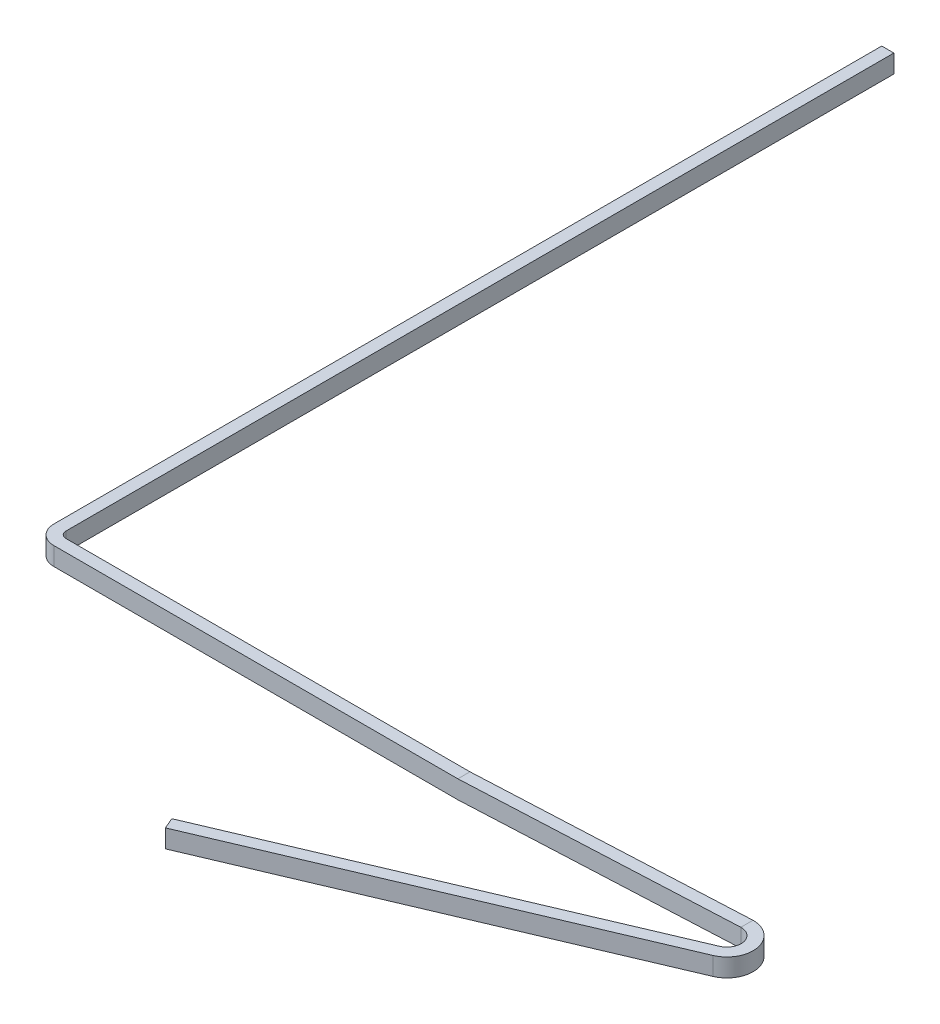
ISO-10303-21;
HEADER;
FILE_DESCRIPTION(('STEP AP214'),'2;1');
FILE_NAME('part.step','',(''),(''),'','','');
FILE_SCHEMA(('AUTOMOTIVE_DESIGN { 1 0 10303 214 1 1 1 1 }'));
ENDSEC;
DATA;
#1=APPLICATION_CONTEXT('core data for automotive mechanical design processes');
#2=APPLICATION_PROTOCOL_DEFINITION('international standard','automotive_design',2000,#1);
#3=PRODUCT_CONTEXT('',#1,'mechanical');
#4=PRODUCT('Part','Part','',(#3));
#5=PRODUCT_RELATED_PRODUCT_CATEGORY('part','',(#4));
#6=PRODUCT_DEFINITION_FORMATION('','',#4);
#7=PRODUCT_DEFINITION_CONTEXT('part definition',#1,'design');
#8=PRODUCT_DEFINITION('design','',#6,#7);
#9=PRODUCT_DEFINITION_SHAPE('','',#8);
#10=(LENGTH_UNIT() NAMED_UNIT(*) SI_UNIT(.MILLI.,.METRE.));
#11=(NAMED_UNIT(*) PLANE_ANGLE_UNIT() SI_UNIT($,.RADIAN.));
#12=(NAMED_UNIT(*) SI_UNIT($,.STERADIAN.) SOLID_ANGLE_UNIT());
#13=UNCERTAINTY_MEASURE_WITH_UNIT(LENGTH_MEASURE(1.E-05),#10,'distance_accuracy_value','');
#14=(GEOMETRIC_REPRESENTATION_CONTEXT(3) GLOBAL_UNCERTAINTY_ASSIGNED_CONTEXT((#13)) GLOBAL_UNIT_ASSIGNED_CONTEXT((#10,
#11,#12)) REPRESENTATION_CONTEXT('',''));
#15=CARTESIAN_POINT('',(0.,0.,0.));
#16=DIRECTION('',(0.,0.,1.));
#17=DIRECTION('',(1.,0.,0.));
#18=AXIS2_PLACEMENT_3D('',#15,#16,#17);
#19=CARTESIAN_POINT('',(0.31,-0.225,20.64));
#20=DIRECTION('',(0.,0.,-1.));
#21=DIRECTION('',(0.,1.,0.));
#22=AXIS2_PLACEMENT_3D('',#19,#20,#21);
#23=PLANE('',#22);
#24=DIRECTION('',(1.,0.,0.));
#25=VECTOR('',#24,1.);
#26=CARTESIAN_POINT('',(5.08257008653312,-0.225,20.64));
#27=LINE('',#26,#25);
#28=CARTESIAN_POINT('',(0.31,-0.225,20.64));
#29=VERTEX_POINT('',#28);
#30=CARTESIAN_POINT('',(10.3151401730662,-0.225,20.64));
#31=VERTEX_POINT('',#30);
#32=EDGE_CURVE('E289',#29,#31,#27,.T.);
#33=ORIENTED_EDGE('',*,*,#32,.F.);
#34=DIRECTION('',(0.,-1.,0.));
#35=VECTOR('',#34,1.);
#36=CARTESIAN_POINT('',(0.31,0.,20.64));
#37=LINE('',#36,#35);
#38=CARTESIAN_POINT('',(0.31,0.225,20.64));
#39=VERTEX_POINT('',#38);
#40=EDGE_CURVE('E313',#39,#29,#37,.T.);
#41=ORIENTED_EDGE('',*,*,#40,.F.);
#42=DIRECTION('',(-1.,0.,0.));
#43=VECTOR('',#42,1.);
#44=CARTESIAN_POINT('',(5.07742991346688,0.225,20.64));
#45=LINE('',#44,#43);
#46=CARTESIAN_POINT('',(10.3048598269338,0.225,20.64));
#47=VERTEX_POINT('',#46);
#48=EDGE_CURVE('E263',#47,#39,#45,.T.);
#49=ORIENTED_EDGE('',*,*,#48,.F.);
#50=DIRECTION('',(-0.99895673691156,-0.0456665936873857,0.));
#51=VECTOR('',#50,1.);
#52=CARTESIAN_POINT('',(13.8048598269338,0.385,20.64));
#53=LINE('',#52,#51);
#54=CARTESIAN_POINT('',(17.3048598270921,0.545,20.6399993303949));
#55=VERTEX_POINT('',#54);
#56=EDGE_CURVE('E132',#55,#47,#53,.T.);
#57=ORIENTED_EDGE('',*,*,#56,.F.);
#58=CARTESIAN_POINT('',(17.3151399102425,0.095,20.6400270025931));
#59=CARTESIAN_POINT('',(17.3146858380326,0.113749939832011,20.640022566309));
#60=CARTESIAN_POINT('',(17.3142341799739,0.132499938445602,20.6400186946619));
#61=CARTESIAN_POINT('',(17.3133361160169,0.169999935673656,20.6400120341087));
#62=CARTESIAN_POINT('',(17.3128897100834,0.188749934287275,20.6400092451953));
#63=CARTESIAN_POINT('',(17.3120025712003,0.226249935784667,20.6400047035344));
#64=CARTESIAN_POINT('',(17.3115618382115,0.24499993866751,20.6400029507797));
#65=CARTESIAN_POINT('',(17.3106853651243,0.282499926602732,20.640000709326));
#66=CARTESIAN_POINT('',(17.3102496249901,0.301249911654272,20.640000220618));
#67=CARTESIAN_POINT('',(17.3093871114534,0.338749894708382,20.639999576322));
#68=CARTESIAN_POINT('',(17.3089603379583,0.357499892708818,20.6399994207307));
#69=CARTESIAN_POINT('',(17.3081165142604,0.394999895451141,20.6399990732163));
#70=CARTESIAN_POINT('',(17.3076994639477,0.413749900190559,20.6399988812938));
#71=CARTESIAN_POINT('',(17.3068740138984,0.451249907745766,20.6399985545529));
#72=CARTESIAN_POINT('',(17.3064656140731,0.469999910559609,20.6399984197341));
#73=CARTESIAN_POINT('',(17.3056568493409,0.507499916188817,20.639998184916));
#74=CARTESIAN_POINT('',(17.3052564843596,0.526249919002582,20.6399980849164));
#75=CARTESIAN_POINT('',(17.3048598274088,0.545,20.6399979911846));
#76=B_SPLINE_CURVE_WITH_KNOTS('',3,(#58,#59,#60,#61,#62,#63,#64,#65,#66,#67,#68,#69,#70,#71,#72,
#73,#74,#75),.UNSPECIFIED.,.F.,.F.,(4,2,2,2,2,2,2,2,4),(0.,0.0562663133702442,0.112532248989982,
0.168797794716484,0.22506293614333,0.281327496504504,0.337591421184688,0.393854769534278,
0.450117598008285),.UNSPECIFIED.);
#77=CARTESIAN_POINT('',(17.3151400834071,0.0949999999999998,20.6400123510316));
#78=VERTEX_POINT('',#77);
#79=EDGE_CURVE('E120',#55,#78,#76,.F.);
#80=ORIENTED_EDGE('',*,*,#79,.T.);
#81=DIRECTION('',(0.99895673691156,0.0456665936873856,0.));
#82=VECTOR('',#81,1.);
#83=CARTESIAN_POINT('',(13.8151401730662,-0.065,20.64));
#84=LINE('',#83,#82);
#85=EDGE_CURVE('E147',#31,#78,#84,.T.);
#86=ORIENTED_EDGE('',*,*,#85,.F.);
#87=EDGE_LOOP('',(#33,#41,#49,#57,#80,#86));
#88=FACE_BOUND('',#87,.T.);
#89=ADVANCED_FACE('F15',(#88),#23,.T.);
#90=CARTESIAN_POINT('',(0.31,-0.27,20.48));
#91=DIRECTION('',(0.,1.,0.));
#92=DIRECTION('',(0.,0.,1.));
#93=AXIS2_PLACEMENT_3D('',#90,#91,#92);
#94=CYLINDRICAL_SURFACE('',#93,0.160000000000002);
#95=DIRECTION('',(0.,-1.,0.));
#96=VECTOR('',#95,1.);
#97=CARTESIAN_POINT('',(0.15,0.,20.48));
#98=LINE('',#97,#96);
#99=CARTESIAN_POINT('',(0.149999999999985,0.225,20.48));
#100=VERTEX_POINT('',#99);
#101=CARTESIAN_POINT('',(0.150000000000026,-0.225,20.48));
#102=VERTEX_POINT('',#101);
#103=EDGE_CURVE('E99',#100,#102,#98,.T.);
#104=ORIENTED_EDGE('',*,*,#103,.F.);
#105=CARTESIAN_POINT('',(0.31,0.225,20.48));
#106=DIRECTION('',(0.,1.,0.));
#107=DIRECTION('',(0.,0.,1.));
#108=AXIS2_PLACEMENT_3D('',#105,#106,#107);
#109=CIRCLE('',#108,0.160000000000002);
#110=EDGE_CURVE('E554',#39,#100,#109,.F.);
#111=ORIENTED_EDGE('',*,*,#110,.F.);
#112=ORIENTED_EDGE('',*,*,#40,.T.);
#113=CARTESIAN_POINT('',(0.31,-0.225,20.48));
#114=DIRECTION('',(0.,1.,0.));
#115=DIRECTION('',(0.,0.,1.));
#116=AXIS2_PLACEMENT_3D('',#113,#114,#115);
#117=CIRCLE('',#116,0.160000000000002);
#118=EDGE_CURVE('E19',#102,#29,#117,.T.);
#119=ORIENTED_EDGE('',*,*,#118,.F.);
#120=EDGE_LOOP('',(#104,#111,#112,#119));
#121=FACE_BOUND('',#120,.T.);
#122=ADVANCED_FACE('F482',(#121),#94,.F.);
#123=CARTESIAN_POINT('',(0.15,-0.225,0.));
#124=DIRECTION('',(1.,0.,0.));
#125=DIRECTION('',(0.,1.,0.));
#126=AXIS2_PLACEMENT_3D('',#123,#124,#125);
#127=PLANE('',#126);
#128=DIRECTION('',(0.,-1.,0.));
#129=VECTOR('',#128,1.);
#130=CARTESIAN_POINT('',(0.15,0.,0.));
#131=LINE('',#130,#129);
#132=CARTESIAN_POINT('',(0.14999999999998,0.225,0.));
#133=VERTEX_POINT('',#132);
#134=CARTESIAN_POINT('',(0.150000000000027,-0.225,0.));
#135=VERTEX_POINT('',#134);
#136=EDGE_CURVE('E111',#133,#135,#131,.T.);
#137=ORIENTED_EDGE('',*,*,#136,.F.);
#138=DIRECTION('',(0.,0.,-1.));
#139=VECTOR('',#138,1.);
#140=CARTESIAN_POINT('',(0.14999999999997,0.225,10.47));
#141=LINE('',#140,#139);
#142=EDGE_CURVE('E306',#100,#133,#141,.T.);
#143=ORIENTED_EDGE('',*,*,#142,.F.);
#144=ORIENTED_EDGE('',*,*,#103,.T.);
#145=DIRECTION('',(0.,0.,1.));
#146=VECTOR('',#145,1.);
#147=CARTESIAN_POINT('',(0.150000000000052,-0.225,10.47));
#148=LINE('',#147,#146);
#149=EDGE_CURVE('E280',#135,#102,#148,.T.);
#150=ORIENTED_EDGE('',*,*,#149,.F.);
#151=EDGE_LOOP('',(#137,#143,#144,#150));
#152=FACE_BOUND('',#151,.T.);
#153=ADVANCED_FACE('F472',(#152),#127,.T.);
#154=CARTESIAN_POINT('',(0.15,-0.225,0.));
#155=DIRECTION('',(0.,0.,-1.));
#156=DIRECTION('',(-1.,0.,0.));
#157=AXIS2_PLACEMENT_3D('',#154,#155,#156);
#158=PLANE('',#157);
#159=DIRECTION('',(0.,-1.,0.));
#160=VECTOR('',#159,1.);
#161=CARTESIAN_POINT('',(-0.15,0.,0.));
#162=LINE('',#161,#160);
#163=CARTESIAN_POINT('',(-0.15,0.225,0.));
#164=VERTEX_POINT('',#163);
#165=CARTESIAN_POINT('',(-0.149999999999999,-0.225,0.));
#166=VERTEX_POINT('',#165);
#167=EDGE_CURVE('E294',#164,#166,#162,.T.);
#168=ORIENTED_EDGE('',*,*,#167,.F.);
#169=DIRECTION('',(-1.,0.,0.));
#170=VECTOR('',#169,1.);
#171=CARTESIAN_POINT('',(5.07742991346688,0.225,0.));
#172=LINE('',#171,#170);
#173=EDGE_CURVE('E302',#133,#164,#172,.T.);
#174=ORIENTED_EDGE('',*,*,#173,.F.);
#175=ORIENTED_EDGE('',*,*,#136,.T.);
#176=DIRECTION('',(1.,0.,0.));
#177=VECTOR('',#176,1.);
#178=CARTESIAN_POINT('',(5.08257008653312,-0.225,0.));
#179=LINE('',#178,#177);
#180=EDGE_CURVE('E283',#166,#135,#179,.T.);
#181=ORIENTED_EDGE('',*,*,#180,.F.);
#182=EDGE_LOOP('',(#168,#174,#175,#181));
#183=FACE_BOUND('',#182,.T.);
#184=ADVANCED_FACE('F461',(#183),#158,.T.);
#185=CARTESIAN_POINT('',(-0.15,0.225,0.));
#186=DIRECTION('',(-1.,0.,0.));
#187=DIRECTION('',(0.,-1.,0.));
#188=AXIS2_PLACEMENT_3D('',#185,#186,#187);
#189=PLANE('',#188);
#190=DIRECTION('',(0.,0.,1.));
#191=VECTOR('',#190,1.);
#192=CARTESIAN_POINT('',(-0.15,0.225,10.47));
#193=LINE('',#192,#191);
#194=CARTESIAN_POINT('',(-0.15,0.225,20.48));
#195=VERTEX_POINT('',#194);
#196=EDGE_CURVE('E305',#164,#195,#193,.T.);
#197=ORIENTED_EDGE('',*,*,#196,.F.);
#198=ORIENTED_EDGE('',*,*,#167,.T.);
#199=DIRECTION('',(0.,0.,-1.));
#200=VECTOR('',#199,1.);
#201=CARTESIAN_POINT('',(-0.15,-0.225,10.47));
#202=LINE('',#201,#200);
#203=CARTESIAN_POINT('',(-0.15,-0.225,20.48));
#204=VERTEX_POINT('',#203);
#205=EDGE_CURVE('E286',#204,#166,#202,.T.);
#206=ORIENTED_EDGE('',*,*,#205,.F.);
#207=DIRECTION('',(0.,1.,0.));
#208=VECTOR('',#207,1.);
#209=CARTESIAN_POINT('',(-0.15,0.,20.48));
#210=LINE('',#209,#208);
#211=EDGE_CURVE('E297',#204,#195,#210,.T.);
#212=ORIENTED_EDGE('',*,*,#211,.T.);
#213=EDGE_LOOP('',(#197,#198,#206,#212));
#214=FACE_BOUND('',#213,.T.);
#215=ADVANCED_FACE('F450',(#214),#189,.T.);
#216=CARTESIAN_POINT('',(-0.15,-0.225,20.94));
#217=DIRECTION('',(0.,-1.,0.));
#218=DIRECTION('',(0.,0.,-1.));
#219=AXIS2_PLACEMENT_3D('',#216,#217,#218);
#220=PLANE('',#219);
#221=ORIENTED_EDGE('',*,*,#149,.T.);
#222=ORIENTED_EDGE('',*,*,#118,.T.);
#223=ORIENTED_EDGE('',*,*,#32,.T.);
#224=DIRECTION('',(0.,0.,-1.));
#225=VECTOR('',#224,1.);
#226=CARTESIAN_POINT('',(10.3151401730662,-0.225,20.79));
#227=LINE('',#226,#225);
#228=CARTESIAN_POINT('',(10.3151401730662,-0.225,20.94));
#229=VERTEX_POINT('',#228);
#230=EDGE_CURVE('E151',#229,#31,#227,.T.);
#231=ORIENTED_EDGE('',*,*,#230,.F.);
#232=DIRECTION('',(1.,0.,0.));
#233=VECTOR('',#232,1.);
#234=CARTESIAN_POINT('',(8.86358550705233,-0.225,20.94));
#235=LINE('',#234,#233);
#236=CARTESIAN_POINT('',(0.310000000000002,-0.225,20.94));
#237=VERTEX_POINT('',#236);
#238=EDGE_CURVE('E163',#237,#229,#235,.T.);
#239=ORIENTED_EDGE('',*,*,#238,.F.);
#240=CARTESIAN_POINT('',(0.310000000000006,-0.225,20.48));
#241=DIRECTION('',(0.,1.,0.));
#242=DIRECTION('',(0.,0.,1.));
#243=AXIS2_PLACEMENT_3D('',#240,#241,#242);
#244=CIRCLE('',#243,0.460000000000002);
#245=EDGE_CURVE('E562',#204,#237,#244,.T.);
#246=ORIENTED_EDGE('',*,*,#245,.F.);
#247=ORIENTED_EDGE('',*,*,#205,.T.);
#248=ORIENTED_EDGE('',*,*,#180,.T.);
#249=EDGE_LOOP('',(#221,#222,#223,#231,#239,#246,#247,#248));
#250=FACE_BOUND('',#249,.T.);
#251=ADVANCED_FACE('F440',(#250),#220,.T.);
#252=CARTESIAN_POINT('',(10.3151401730662,-0.225,20.64));
#253=DIRECTION('',(0.0456665936873856,-0.99895673691156,0.));
#254=DIRECTION('',(0.99895673691156,0.0456665936873856,0.));
#255=AXIS2_PLACEMENT_3D('',#252,#253,#254);
#256=PLANE('',#255);
#257=DIRECTION('',(0.99895673691156,0.0456665936873854,0.));
#258=VECTOR('',#257,1.);
#259=CARTESIAN_POINT('',(10.3151401730662,-0.225,20.94));
#260=LINE('',#259,#258);
#261=CARTESIAN_POINT('',(17.3151400899458,0.0949999999999996,20.9400169498998));
#262=VERTEX_POINT('',#261);
#263=EDGE_CURVE('E145',#229,#262,#260,.T.);
#264=ORIENTED_EDGE('',*,*,#263,.F.);
#265=ORIENTED_EDGE('',*,*,#230,.T.);
#266=ORIENTED_EDGE('',*,*,#85,.T.);
#267=DIRECTION('',(0.,0.,1.));
#268=VECTOR('',#267,1.);
#269=CARTESIAN_POINT('',(17.3151401730662,0.0949999999999969,20.64));
#270=LINE('',#269,#268);
#271=EDGE_CURVE('E141',#78,#262,#270,.T.);
#272=ORIENTED_EDGE('',*,*,#271,.T.);
#273=EDGE_LOOP('',(#264,#265,#266,#272));
#274=FACE_BOUND('',#273,.T.);
#275=ADVANCED_FACE('F143',(#274),#256,.T.);
#276=CARTESIAN_POINT('',(17.3048598269338,0.545,20.64));
#277=DIRECTION('',(-0.0456665936873857,0.99895673691156,0.));
#278=DIRECTION('',(-0.99895673691156,-0.0456665936873857,0.));
#279=AXIS2_PLACEMENT_3D('',#276,#277,#278);
#280=PLANE('',#279);
#281=ORIENTED_EDGE('',*,*,#56,.T.);
#282=DIRECTION('',(0.,0.,-1.));
#283=VECTOR('',#282,1.);
#284=CARTESIAN_POINT('',(10.3048598269338,0.225,10.47));
#285=LINE('',#284,#283);
#286=CARTESIAN_POINT('',(10.3048598269345,0.225000000000019,20.94));
#287=VERTEX_POINT('',#286);
#288=EDGE_CURVE('E265',#287,#47,#285,.T.);
#289=ORIENTED_EDGE('',*,*,#288,.F.);
#290=DIRECTION('',(-0.99895673691156,-0.0456665936873854,0.));
#291=VECTOR('',#290,1.);
#292=CARTESIAN_POINT('',(17.3048598269337,0.545,20.94));
#293=LINE('',#292,#291);
#294=CARTESIAN_POINT('',(17.304859826958,0.544999999908367,20.9399996051879));
#295=VERTEX_POINT('',#294);
#296=EDGE_CURVE('E164',#295,#287,#293,.T.);
#297=ORIENTED_EDGE('',*,*,#296,.F.);
#298=DIRECTION('',(0.,0.,-1.));
#299=VECTOR('',#298,1.);
#300=CARTESIAN_POINT('',(17.3048598269338,0.545,20.79));
#301=LINE('',#300,#299);
#302=EDGE_CURVE('E259',#295,#55,#301,.T.);
#303=ORIENTED_EDGE('',*,*,#302,.T.);
#304=EDGE_LOOP('',(#281,#289,#297,#303));
#305=FACE_BOUND('',#304,.T.);
#306=ADVANCED_FACE('F267',(#305),#280,.T.);
#307=CARTESIAN_POINT('',(-0.15,0.225,0.));
#308=DIRECTION('',(0.,1.,0.));
#309=DIRECTION('',(0.,0.,1.));
#310=AXIS2_PLACEMENT_3D('',#307,#308,#309);
#311=PLANE('',#310);
#312=ORIENTED_EDGE('',*,*,#196,.T.);
#313=CARTESIAN_POINT('',(0.310000000000006,0.225,20.48));
#314=DIRECTION('',(0.,1.,0.));
#315=DIRECTION('',(0.,0.,1.));
#316=AXIS2_PLACEMENT_3D('',#313,#314,#315);
#317=CIRCLE('',#316,0.460000000000002);
#318=CARTESIAN_POINT('',(0.310000000000003,0.225,20.94));
#319=VERTEX_POINT('',#318);
#320=EDGE_CURVE('E279',#319,#195,#317,.F.);
#321=ORIENTED_EDGE('',*,*,#320,.F.);
#322=DIRECTION('',(-1.,0.,0.));
#323=VECTOR('',#322,1.);
#324=CARTESIAN_POINT('',(8.86358550705233,0.225000000000001,20.94));
#325=LINE('',#324,#323);
#326=EDGE_CURVE('E571',#287,#319,#325,.T.);
#327=ORIENTED_EDGE('',*,*,#326,.F.);
#328=ORIENTED_EDGE('',*,*,#288,.T.);
#329=ORIENTED_EDGE('',*,*,#48,.T.);
#330=ORIENTED_EDGE('',*,*,#110,.T.);
#331=ORIENTED_EDGE('',*,*,#142,.T.);
#332=ORIENTED_EDGE('',*,*,#173,.T.);
#333=EDGE_LOOP('',(#312,#321,#327,#328,#329,#330,#331,#332));
#334=FACE_BOUND('',#333,.T.);
#335=ADVANCED_FACE('F411',(#334),#311,.T.);
#336=CARTESIAN_POINT('',(0.310000000000006,-0.27,20.48));
#337=DIRECTION('',(0.,1.,0.));
#338=DIRECTION('',(0.,0.,1.));
#339=AXIS2_PLACEMENT_3D('',#336,#337,#338);
#340=CYLINDRICAL_SURFACE('',#339,0.460000000000002);
#341=ORIENTED_EDGE('',*,*,#320,.T.);
#342=ORIENTED_EDGE('',*,*,#211,.F.);
#343=ORIENTED_EDGE('',*,*,#245,.T.);
#344=DIRECTION('',(0.,-1.,0.));
#345=VECTOR('',#344,1.);
#346=CARTESIAN_POINT('',(0.31,0.16231,20.94));
#347=LINE('',#346,#345);
#348=EDGE_CURVE('E343',#319,#237,#347,.T.);
#349=ORIENTED_EDGE('',*,*,#348,.F.);
#350=EDGE_LOOP('',(#341,#342,#343,#349));
#351=FACE_BOUND('',#350,.T.);
#352=ADVANCED_FACE('F402',(#351),#340,.T.);
#353=CARTESIAN_POINT('',(0.31,0.54962,20.94));
#354=DIRECTION('',(0.,0.,1.));
#355=DIRECTION('',(0.,-1.,0.));
#356=AXIS2_PLACEMENT_3D('',#353,#354,#355);
#357=PLANE('',#356);
#358=ORIENTED_EDGE('',*,*,#326,.T.);
#359=ORIENTED_EDGE('',*,*,#348,.T.);
#360=ORIENTED_EDGE('',*,*,#238,.T.);
#361=ORIENTED_EDGE('',*,*,#263,.T.);
#362=CARTESIAN_POINT('',(17.3048598270002,0.545,20.9399988155637));
#363=CARTESIAN_POINT('',(17.305341366253,0.526250161682932,20.9399988741035));
#364=CARTESIAN_POINT('',(17.305816775386,0.507500165289139,20.939998924222));
#365=CARTESIAN_POINT('',(17.3067540644748,0.470000172495272,20.9399990560245));
#366=CARTESIAN_POINT('',(17.3072159446741,0.451250176101284,20.9399991377081));
#367=CARTESIAN_POINT('',(17.3081249155102,0.413750190600323,20.9399993810457));
#368=CARTESIAN_POINT('',(17.3085720064359,0.395000201500379,20.9399995426981));
#369=CARTESIAN_POINT('',(17.3094479722974,0.357500185312601,20.9399997266508));
#370=CARTESIAN_POINT('',(17.3098768476088,0.33875015823353,20.939999748954));
#371=CARTESIAN_POINT('',(17.3107229000155,0.301250122222791,20.9400006699501));
#372=CARTESIAN_POINT('',(17.3111400772857,0.282500113295045,20.9400015686298));
#373=CARTESIAN_POINT('',(17.3119649372826,0.245000103123681,20.9400044336971));
#374=CARTESIAN_POINT('',(17.3123726201189,0.226250101882471,20.9400064000722));
#375=CARTESIAN_POINT('',(17.3131786044423,0.188750097679611,20.940011351507));
#376=CARTESIAN_POINT('',(17.3135769060292,0.170000094720103,20.9400143365557));
#377=CARTESIAN_POINT('',(17.3143647634013,0.132500088799377,20.9400213363988));
#378=CARTESIAN_POINT('',(17.3147543192719,0.113750085839956,20.9400253511831));
#379=CARTESIAN_POINT('',(17.3151398217028,0.095,20.9400298863924));
#380=B_SPLINE_CURVE_WITH_KNOTS('',3,(#362,#363,#364,#365,#366,#367,#368,#369,#370,#371,#372,
#373,#374,#375,#376,#377,#378,#379),.UNSPECIFIED.,.F.,.F.,(4,2,2,2,2,2,2,2,4),(0.,
0.0562680622313328,0.112535110792974,0.168801058926705,0.225065846304957,0.281329792100164,
0.33759308848215,0.393855786039627,0.450117932917167),.UNSPECIFIED.);
#381=EDGE_CURVE('E159',#295,#262,#380,.T.);
#382=ORIENTED_EDGE('',*,*,#381,.F.);
#383=ORIENTED_EDGE('',*,*,#296,.T.);
#384=EDGE_LOOP('',(#358,#359,#360,#361,#382,#383));
#385=FACE_BOUND('',#384,.T.);
#386=ADVANCED_FACE('F157',(#385),#357,.T.);
#387=CARTESIAN_POINT('',(7.88120866507169,0.545,20.64));
#388=DIRECTION('',(0.,1.,0.));
#389=DIRECTION('',(0.,0.,1.));
#390=AXIS2_PLACEMENT_3D('',#387,#388,#389);
#391=PLANE('',#390);
#392=DIRECTION('',(1.,0.,0.));
#393=VECTOR('',#392,1.);
#394=CARTESIAN_POINT('',(7.88120866507169,0.545,20.9399988155637));
#395=LINE('',#394,#393);
#396=CARTESIAN_POINT('',(17.3099999999959,0.545,20.94));
#397=VERTEX_POINT('',#396);
#398=EDGE_CURVE('E174',#397,#295,#395,.F.);
#399=ORIENTED_EDGE('',*,*,#398,.F.);
#400=CARTESIAN_POINT('',(17.4468982813718,0.545,21.6121162221271));
#401=CARTESIAN_POINT('',(17.4832168228054,0.545,21.5967167026278));
#402=CARTESIAN_POINT('',(17.5167935222807,0.545,21.5749093463835));
#403=CARTESIAN_POINT('',(17.5750871937299,0.545,21.521629948673));
#404=CARTESIAN_POINT('',(17.599809079499,0.545,21.4901632854996));
#405=CARTESIAN_POINT('',(17.6370496477913,0.545,21.4207206403006));
#406=CARTESIAN_POINT('',(17.6495783151174,0.545,21.3827500142691));
#407=CARTESIAN_POINT('',(17.661683578468,0.545,21.3049572144616));
#408=CARTESIAN_POINT('',(17.661310742984,0.545,21.2651428803674));
#409=CARTESIAN_POINT('',(17.6470501990881,0.545,21.1877618490349));
#410=CARTESIAN_POINT('',(17.6330864788598,0.545,21.1502090549938));
#411=CARTESIAN_POINT('',(17.5939141892113,0.545,21.0819440356125));
#412=CARTESIAN_POINT('',(17.5687884775295,0.545,21.0511838609029));
#413=CARTESIAN_POINT('',(17.5093423644816,0.545,20.9995690520426));
#414=CARTESIAN_POINT('',(17.4749443224733,0.545,20.9788023863393));
#415=CARTESIAN_POINT('',(17.4178545314172,0.545,20.956309537812));
#416=CARTESIAN_POINT('',(17.3967640847146,0.545,20.9502226907248));
#417=CARTESIAN_POINT('',(17.3537994275214,0.545,20.9420615933634));
#418=CARTESIAN_POINT('',(17.3319244702842,0.545,20.9399912753899));
#419=CARTESIAN_POINT('',(17.3099999999971,0.545,20.94));
#420=B_SPLINE_CURVE_WITH_KNOTS('',3,(#400,#401,#402,#403,#404,#405,#406,#407,#408,#409,#410,
#411,#412,#413,#414,#415,#416,#417,#418,#419),.UNSPECIFIED.,.F.,.F.,(4,2,2,2,2,2,2,2,2,4),(0.,
0.117848498601392,0.235631497928515,0.353317965559696,0.470543203933601,0.588427855555162,
0.705451679315296,0.823487579408398,0.889004181516861,0.954584894012087),.UNSPECIFIED.);
#421=CARTESIAN_POINT('',(17.4468982813718,0.545,21.6121162221271));
#422=VERTEX_POINT('',#421);
#423=EDGE_CURVE('E226',#422,#397,#420,.T.);
#424=ORIENTED_EDGE('',*,*,#423,.F.);
#425=DIRECTION('',(0.920332063220277,0.,-0.391137946776719));
#426=VECTOR('',#425,1.);
#427=CARTESIAN_POINT('',(12.6941137946777,0.545,23.632033206322));
#428=LINE('',#427,#426);
#429=CARTESIAN_POINT('',(7.94132930798349,0.545,25.651950190517));
#430=VERTEX_POINT('',#429);
#431=EDGE_CURVE('E176',#430,#422,#428,.T.);
#432=ORIENTED_EDGE('',*,*,#431,.F.);
#433=DIRECTION('',(0.391137946776799,0.,0.920332063220243));
#434=VECTOR('',#433,1.);
#435=CARTESIAN_POINT('',(7.94132930798349,0.545,25.651950190517));
#436=LINE('',#435,#434);
#437=CARTESIAN_POINT('',(8.05867069201651,0.545,25.928049809483));
#438=VERTEX_POINT('',#437);
#439=EDGE_CURVE('E235',#430,#438,#436,.T.);
#440=ORIENTED_EDGE('',*,*,#439,.T.);
#441=DIRECTION('',(-0.920332063220278,0.,0.391137946776717));
#442=VECTOR('',#441,1.);
#443=CARTESIAN_POINT('',(12.8114551787107,0.545,23.9081328252881));
#444=LINE('',#443,#442);
#445=CARTESIAN_POINT('',(17.5642396654048,0.545,21.8882158410932));
#446=VERTEX_POINT('',#445);
#447=EDGE_CURVE('E340',#446,#438,#444,.T.);
#448=ORIENTED_EDGE('',*,*,#447,.F.);
#449=CARTESIAN_POINT('',(17.3100000000001,0.545,20.64));
#450=CARTESIAN_POINT('',(17.348360659457,0.545,20.6400043187598));
#451=CARTESIAN_POINT('',(17.3866209385164,0.545,20.6434038848482));
#452=CARTESIAN_POINT('',(17.4619415597412,0.545,20.6568465049287));
#453=CARTESIAN_POINT('',(17.499002308775,0.545,20.6668872809853));
#454=CARTESIAN_POINT('',(17.6035320282845,0.545,20.7055004010782));
#455=CARTESIAN_POINT('',(17.6681440251927,0.545,20.742620385323));
#456=CARTESIAN_POINT('',(17.7525656869372,0.545,20.8125639201107));
#457=CARTESIAN_POINT('',(17.778638389113,0.545,20.8382803707188));
#458=CARTESIAN_POINT('',(17.8261720771771,0.545,20.8937547333407));
#459=CARTESIAN_POINT('',(17.8476291528474,0.545,20.9235160374768));
#460=CARTESIAN_POINT('',(17.8853439325006,0.545,20.9861354727813));
#461=CARTESIAN_POINT('',(17.9016047914567,0.545,21.0189917090554));
#462=CARTESIAN_POINT('',(17.928435932194,0.545,21.0869629085811));
#463=CARTESIAN_POINT('',(17.93900288855,0.545,21.1220791783944));
#464=CARTESIAN_POINT('',(17.9612540661673,0.545,21.2293255295456));
#465=CARTESIAN_POINT('',(17.9636128932808,0.545,21.3035587484413));
#466=CARTESIAN_POINT('',(17.9441916893231,0.545,21.4485985844085));
#467=CARTESIAN_POINT('',(17.9224709915609,0.545,21.5194131773757));
#468=CARTESIAN_POINT('',(17.8729741328099,0.545,21.6169868626308));
#469=CARTESIAN_POINT('',(17.8535562915535,0.545,21.648165351903));
#470=CARTESIAN_POINT('',(17.8097359898803,0.545,21.7068684213279));
#471=CARTESIAN_POINT('',(17.7853277505727,0.545,21.7343887037458));
#472=CARTESIAN_POINT('',(17.7305486135112,0.545,21.7866956558066));
#473=CARTESIAN_POINT('',(17.6998905989951,0.545,21.8111822524823));
#474=CARTESIAN_POINT('',(17.634723418557,0.545,21.8542980704109));
#475=CARTESIAN_POINT('',(17.6002156647726,0.545,21.872929429936));
#476=CARTESIAN_POINT('',(17.5642396654048,0.545,21.8882158410932));
#477=B_SPLINE_CURVE_WITH_KNOTS('',3,(#449,#450,#451,#452,#453,#454,#455,#456,#457,#458,#459,
#460,#461,#462,#463,#464,#465,#466,#467,#468,#469,#470,#471,#472,#473,#474,#475,#476),
.UNSPECIFIED.,.F.,.F.,(4,2,2,2,2,2,2,2,2,2,2,2,2,4),(0.,0.114735445989222,0.229431558106404,
0.447998711030201,0.557446763097865,0.666987174205629,0.776460949023116,0.885998590996755,
1.10439143493594,1.3222473403055,1.43195857758311,1.54179758766615,1.65888211010858,
1.77592382467113),.UNSPECIFIED.);
#478=CARTESIAN_POINT('',(17.3100000000001,0.545,20.64));
#479=VERTEX_POINT('',#478);
#480=EDGE_CURVE('E248',#479,#446,#477,.T.);
#481=ORIENTED_EDGE('',*,*,#480,.F.);
#482=DIRECTION('',(1.,0.,0.));
#483=VECTOR('',#482,1.);
#484=CARTESIAN_POINT('',(7.88120866507169,0.545,20.64));
#485=LINE('',#484,#483);
#486=EDGE_CURVE('E255',#55,#479,#485,.T.);
#487=ORIENTED_EDGE('',*,*,#486,.F.);
#488=ORIENTED_EDGE('',*,*,#302,.F.);
#489=EDGE_LOOP('',(#399,#424,#432,#440,#448,#481,#487,#488));
#490=FACE_BOUND('',#489,.T.);
#491=ADVANCED_FACE('F237',(#490),#391,.T.);
#492=CARTESIAN_POINT('',(8.0586706920165,0.095,25.928049809483));
#493=DIRECTION('',(0.391137946776717,0.,0.920332063220278));
#494=DIRECTION('',(0.920332063220278,0.,-0.391137946776717));
#495=AXIS2_PLACEMENT_3D('',#492,#493,#494);
#496=PLANE('',#495);
#497=DIRECTION('',(-0.920332063220278,0.,0.391137946776718));
#498=VECTOR('',#497,1.);
#499=CARTESIAN_POINT('',(17.5642396654049,0.095,21.8882158410932));
#500=LINE('',#499,#498);
#501=CARTESIAN_POINT('',(17.5642396654049,0.095,21.8882158410932));
#502=VERTEX_POINT('',#501);
#503=CARTESIAN_POINT('',(8.0586706920165,0.095,25.928049809483));
#504=VERTEX_POINT('',#503);
#505=EDGE_CURVE('E185',#502,#504,#500,.T.);
#506=ORIENTED_EDGE('',*,*,#505,.F.);
#507=DIRECTION('',(0.,-1.,0.));
#508=VECTOR('',#507,1.);
#509=CARTESIAN_POINT('',(17.5642396654048,0.32,21.8882158410932));
#510=LINE('',#509,#508);
#511=EDGE_CURVE('E254',#446,#502,#510,.T.);
#512=ORIENTED_EDGE('',*,*,#511,.F.);
#513=ORIENTED_EDGE('',*,*,#447,.T.);
#514=DIRECTION('',(0.,-1.,0.));
#515=VECTOR('',#514,1.);
#516=CARTESIAN_POINT('',(8.0586706920165,0.32,25.928049809483));
#517=LINE('',#516,#515);
#518=EDGE_CURVE('E337',#438,#504,#517,.T.);
#519=ORIENTED_EDGE('',*,*,#518,.T.);
#520=EDGE_LOOP('',(#506,#512,#513,#519));
#521=FACE_BOUND('',#520,.T.);
#522=ADVANCED_FACE('F242',(#521),#496,.T.);
#523=CARTESIAN_POINT('',(17.4468982813718,0.095,21.6121162221271));
#524=DIRECTION('',(-0.39113794677672,0.,-0.920332063220277));
#525=DIRECTION('',(-0.920332063220277,0.,0.39113794677672));
#526=AXIS2_PLACEMENT_3D('',#523,#524,#525);
#527=PLANE('',#526);
#528=ORIENTED_EDGE('',*,*,#431,.T.);
#529=DIRECTION('',(0.,1.,0.));
#530=VECTOR('',#529,1.);
#531=CARTESIAN_POINT('',(17.4468982813718,0.32,21.6121162221271));
#532=LINE('',#531,#530);
#533=CARTESIAN_POINT('',(17.4468982813718,0.095,21.6121162221271));
#534=VERTEX_POINT('',#533);
#535=EDGE_CURVE('E175',#534,#422,#532,.T.);
#536=ORIENTED_EDGE('',*,*,#535,.F.);
#537=DIRECTION('',(0.920332063220279,0.,-0.391137946776714));
#538=VECTOR('',#537,1.);
#539=CARTESIAN_POINT('',(7.94132930798349,0.095,25.6519501905169));
#540=LINE('',#539,#538);
#541=CARTESIAN_POINT('',(7.94132930798348,0.095,25.651950190517));
#542=VERTEX_POINT('',#541);
#543=EDGE_CURVE('E182',#542,#534,#540,.T.);
#544=ORIENTED_EDGE('',*,*,#543,.F.);
#545=DIRECTION('',(0.,1.,0.));
#546=VECTOR('',#545,1.);
#547=CARTESIAN_POINT('',(7.94132930798349,0.32,25.651950190517));
#548=LINE('',#547,#546);
#549=EDGE_CURVE('E33',#542,#430,#548,.T.);
#550=ORIENTED_EDGE('',*,*,#549,.T.);
#551=EDGE_LOOP('',(#528,#536,#544,#550));
#552=FACE_BOUND('',#551,.T.);
#553=ADVANCED_FACE('F208',(#552),#527,.T.);
#554=CARTESIAN_POINT('',(17.2964960466426,0.545,20.9399990424635));
#555=CARTESIAN_POINT('',(17.3013407863884,0.545,20.9399985603949));
#556=CARTESIAN_POINT('',(17.3060576306788,0.545,20.9399983767227));
#557=CARTESIAN_POINT('',(17.3221487614917,0.545,20.9400050022732));
#558=CARTESIAN_POINT('',(17.3300015939791,0.545,20.9404291023397));
#559=CARTESIAN_POINT('',(17.349915868963,0.545,20.9421399708764));
#560=CARTESIAN_POINT('',(17.3598334632571,0.545,20.9434218193108));
#561=CARTESIAN_POINT('',(17.3893659714026,0.545,20.9485321680292));
#562=CARTESIAN_POINT('',(17.4087606883959,0.545,20.9536290289917));
#563=CARTESIAN_POINT('',(17.465210450649,0.545,20.9737625398497));
#564=CARTESIAN_POINT('',(17.5004741867122,0.545,20.9936625385647));
#565=CARTESIAN_POINT('',(17.593302370079,0.545,21.0694892431176));
#566=CARTESIAN_POINT('',(17.6370098672597,0.545,21.14184536003));
#567=CARTESIAN_POINT('',(17.6689065675113,0.545,21.2984454974237));
#568=CARTESIAN_POINT('',(17.656982448521,0.545,21.3821326817591));
#569=CARTESIAN_POINT('',(17.5826169077395,0.545,21.5235921065538));
#570=CARTESIAN_POINT('',(17.5205491717276,0.545,21.5808148482173));
#571=CARTESIAN_POINT('',(17.4468982813718,0.545,21.6121162221271));
#572=CARTESIAN_POINT('',(17.2964960466426,0.095,20.9399990424635));
#573=CARTESIAN_POINT('',(17.3013407863884,0.095,20.9399985603949));
#574=CARTESIAN_POINT('',(17.3060576306788,0.095,20.9399983767227));
#575=CARTESIAN_POINT('',(17.3221487614917,0.095,20.9400050022732));
#576=CARTESIAN_POINT('',(17.3300015939791,0.095,20.9404291023397));
#577=CARTESIAN_POINT('',(17.349915868963,0.095,20.9421399708764));
#578=CARTESIAN_POINT('',(17.3598334632571,0.095,20.9434218193108));
#579=CARTESIAN_POINT('',(17.3893659714026,0.095,20.9485321680291));
#580=CARTESIAN_POINT('',(17.4087606883959,0.095,20.9536290289917));
#581=CARTESIAN_POINT('',(17.465210450649,0.095,20.9737625398497));
#582=CARTESIAN_POINT('',(17.5004741867122,0.095,20.9936625385647));
#583=CARTESIAN_POINT('',(17.593302370079,0.095,21.0694892431176));
#584=CARTESIAN_POINT('',(17.6370098672597,0.095,21.14184536003));
#585=CARTESIAN_POINT('',(17.6689065675113,0.095,21.2984454974237));
#586=CARTESIAN_POINT('',(17.656982448521,0.095,21.3821326817591));
#587=CARTESIAN_POINT('',(17.5826169077395,0.095,21.5235921065538));
#588=CARTESIAN_POINT('',(17.5205491717276,0.095,21.5808148482173));
#589=CARTESIAN_POINT('',(17.4468982813718,0.095,21.6121162221271));
#590=B_SPLINE_SURFACE_WITH_KNOTS('',1,3,((#554,#555,#556,#557,#558,#559,#560,#561,#562,#563,
#564,#565,#566,#567,#568,#569,#570,#571),(#572,#573,#574,#575,#576,#577,#578,#579,#580,#581,
#582,#583,#584,#585,#586,#587,#588,#589)),.UNSPECIFIED.,.F.,.F.,.F.,(2,2),(4,2,2,2,2,2,2,2,4),
(0.,1.),(-0.00118749139723,0.,0.00365936029408,0.00731872058815,0.0146374411763,
0.02927488235261,0.05854976470521,0.08782464705782,0.11709952941042),.UNSPECIFIED.);
#591=CARTESIAN_POINT('',(17.4468982813718,0.095,21.6121162221271));
#592=CARTESIAN_POINT('',(17.4832168170125,0.095,21.596716700804));
#593=CARTESIAN_POINT('',(17.5167935193851,0.095,21.5749093454719));
#594=CARTESIAN_POINT('',(17.575087196624,0.095,21.521629949584));
#595=CARTESIAN_POINT('',(17.5998090852855,0.095,21.4901632873213));
#596=CARTESIAN_POINT('',(17.6370496420096,0.095,21.4207206384803));
#597=CARTESIAN_POINT('',(17.6495782948893,0.095,21.3827500079006));
#598=CARTESIAN_POINT('',(17.6616835986169,0.095,21.3049572208049));
#599=CARTESIAN_POINT('',(17.6613108176852,0.095,21.2651429038852));
#600=CARTESIAN_POINT('',(17.6470501239667,0.095,21.1877618253848));
#601=CARTESIAN_POINT('',(17.6330861979055,0.095,21.1502089665421));
#602=CARTESIAN_POINT('',(17.5939144681139,0.095,21.0819441234183));
#603=CARTESIAN_POINT('',(17.5687895150386,0.095,21.0511841875376));
#604=CARTESIAN_POINT('',(17.5093413179996,0.095,20.999568722583));
#605=CARTESIAN_POINT('',(17.4749404021921,0.095,20.9788011521335));
#606=CARTESIAN_POINT('',(17.4186476323561,0.095,20.9566218466566));
#607=CARTESIAN_POINT('',(17.3984065012992,0.095,20.9507000996035));
#608=CARTESIAN_POINT('',(17.3571820074186,0.095,20.9425574074722));
#609=CARTESIAN_POINT('',(17.336198261789,0.095,20.940338400331));
#610=CARTESIAN_POINT('',(17.3151399378362,0.095,20.9400298877578));
#611=B_SPLINE_CURVE_WITH_KNOTS('',3,(#591,#592,#593,#594,#595,#596,#597,#598,#599,#600,#601,
#602,#603,#604,#605,#606,#607,#608,#609,#610),.UNSPECIFIED.,.F.,.F.,(4,2,2,2,2,2,2,2,2,4),(0.,
0.117848498601423,0.235631497928577,0.353317965559755,0.470543203933663,0.588427855555187,
0.705451679315334,0.823487579408406,0.886460963945284,0.949467297114732),.UNSPECIFIED.);
#612=EDGE_CURVE('E172',#534,#262,#611,.T.);
#613=ORIENTED_EDGE('',*,*,#423,.T.);
#614=ORIENTED_EDGE('',*,*,#398,.T.);
#615=ORIENTED_EDGE('',*,*,#381,.T.);
#616=ORIENTED_EDGE('',*,*,#612,.F.);
#617=ORIENTED_EDGE('',*,*,#535,.T.);
#618=EDGE_LOOP('',(#613,#614,#615,#616,#617));
#619=FACE_BOUND('',#618,.T.);
#620=ADVANCED_FACE('F170',(#619),#590,.T.);
#621=CARTESIAN_POINT('',(17.2966109192775,0.095,20.6399980422929));
#622=CARTESIAN_POINT('',(17.3007509376819,0.095,20.63999729509));
#623=CARTESIAN_POINT('',(17.3050407498811,0.095,20.6399971970253));
#624=CARTESIAN_POINT('',(17.326436507925,0.095,20.640009289936));
#625=CARTESIAN_POINT('',(17.3471458173897,0.095,20.6407969043451));
#626=CARTESIAN_POINT('',(17.3841294709312,0.095,20.6439742316277));
#627=CARTESIAN_POINT('',(17.4025478603345,0.095,20.6463548072916));
#628=CARTESIAN_POINT('',(17.4573939468907,0.095,20.6558454549112));
#629=CARTESIAN_POINT('',(17.4934127070211,0.095,20.6653110538417));
#630=CARTESIAN_POINT('',(17.5982479797767,0.095,20.702701859721));
#631=CARTESIAN_POINT('',(17.6637377753225,0.095,20.7396590001917));
#632=CARTESIAN_POINT('',(17.8361329730039,0.095,20.8804800229327));
#633=CARTESIAN_POINT('',(17.9173040391961,0.095,21.0148556686268));
#634=CARTESIAN_POINT('',(17.9765407682357,0.095,21.3056844952157));
#635=CARTESIAN_POINT('',(17.9543959758246,0.095,21.4611035518385));
#636=CARTESIAN_POINT('',(17.8162885429449,0.095,21.7238139121712));
#637=CARTESIAN_POINT('',(17.7010198903513,0.095,21.8300847181179));
#638=CARTESIAN_POINT('',(17.5642396654048,0.095,21.8882158410932));
#639=CARTESIAN_POINT('',(17.2966109192775,0.545,20.6399980422929));
#640=CARTESIAN_POINT('',(17.3007509376819,0.545,20.63999729509));
#641=CARTESIAN_POINT('',(17.3050407498811,0.545,20.6399971970253));
#642=CARTESIAN_POINT('',(17.326436507925,0.545,20.640009289936));
#643=CARTESIAN_POINT('',(17.3471458173897,0.545,20.6407969043451));
#644=CARTESIAN_POINT('',(17.3841294709312,0.545,20.6439742316277));
#645=CARTESIAN_POINT('',(17.4025478603345,0.545,20.6463548072916));
#646=CARTESIAN_POINT('',(17.4573939468907,0.545,20.6558454549112));
#647=CARTESIAN_POINT('',(17.4934127070211,0.545,20.6653110538417));
#648=CARTESIAN_POINT('',(17.5982479797767,0.545,20.702701859721));
#649=CARTESIAN_POINT('',(17.6637377753225,0.545,20.7396590001917));
#650=CARTESIAN_POINT('',(17.8361329730039,0.545,20.8804800229327));
#651=CARTESIAN_POINT('',(17.9173040391961,0.545,21.0148556686268));
#652=CARTESIAN_POINT('',(17.9765407682357,0.545,21.3056844952157));
#653=CARTESIAN_POINT('',(17.9543959758246,0.545,21.4611035518385));
#654=CARTESIAN_POINT('',(17.8162885429449,0.545,21.7238139121712));
#655=CARTESIAN_POINT('',(17.7010198903513,0.545,21.8300847181179));
#656=CARTESIAN_POINT('',(17.5642396654048,0.545,21.8882158410932));
#657=B_SPLINE_SURFACE_WITH_KNOTS('',1,3,((#621,#622,#623,#624,#625,#626,#627,#628,#629,#630,
#631,#632,#633,#634,#635,#636,#637,#638),(#639,#640,#641,#642,#643,#644,#645,#646,#647,#648,
#649,#650,#651,#652,#653,#654,#655,#656)),.UNSPECIFIED.,.F.,.F.,.F.,(2,2),(4,2,2,2,2,2,2,2,4),
(0.,1.),(-0.00110410818748,0.,0.00365936029408,0.00731872058815,0.0146374411763,
0.02927488235261,0.05854976470521,0.08782464705782,0.11709952941042),.UNSPECIFIED.);
#658=CARTESIAN_POINT('',(17.315139940769,0.095,20.6400270028903));
#659=CARTESIAN_POINT('',(17.3534249712912,0.095,20.6402939844935));
#660=CARTESIAN_POINT('',(17.3916804792871,0.095,20.6440107053523));
#661=CARTESIAN_POINT('',(17.4669406808812,0.095,20.6580772020236));
#662=CARTESIAN_POINT('',(17.5039457662984,0.095,20.6684248793546));
#663=CARTESIAN_POINT('',(17.5740824480959,0.095,20.6949367631885));
#664=CARTESIAN_POINT('',(17.60731038956,0.095,20.7108471530587));
#665=CARTESIAN_POINT('',(17.6706886697449,0.095,20.7480204566959));
#666=CARTESIAN_POINT('',(17.700835058014,0.095,20.7692901228545));
#667=CARTESIAN_POINT('',(17.7568300640556,0.095,20.8165754191999));
#668=CARTESIAN_POINT('',(17.7827036725623,0.095,20.8425614398771));
#669=CARTESIAN_POINT('',(17.8297168549838,0.095,20.898437774659));
#670=CARTESIAN_POINT('',(17.8508625523725,0.095,20.9283229582393));
#671=CARTESIAN_POINT('',(17.8880479070958,0.095,20.9912839710134));
#672=CARTESIAN_POINT('',(17.9040661956038,0.095,21.0243724233305));
#673=CARTESIAN_POINT('',(17.930308438142,0.095,21.0927128157921));
#674=CARTESIAN_POINT('',(17.9405438104795,0.095,21.1279603391782));
#675=CARTESIAN_POINT('',(17.9547218537206,0.095,21.1996598640834));
#676=CARTESIAN_POINT('',(17.9586710841017,0.095,21.2361105694951));
#677=CARTESIAN_POINT('',(17.960441703734,0.095,21.3091175227896));
#678=CARTESIAN_POINT('',(17.9582677840974,0.095,21.3456736684523));
#679=CARTESIAN_POINT('',(17.9479418334108,0.095,21.418013947469));
#680=CARTESIAN_POINT('',(17.9397767418095,0.095,21.4537962180817));
#681=CARTESIAN_POINT('',(17.9176066449797,0.095,21.5234345759257));
#682=CARTESIAN_POINT('',(17.9036140912895,0.095,21.5572945961825));
#683=CARTESIAN_POINT('',(17.8699281073088,0.095,21.6221543155955));
#684=CARTESIAN_POINT('',(17.8502210790301,0.095,21.6531469568352));
#685=CARTESIAN_POINT('',(17.8059242814463,0.095,21.7113695537051));
#686=CARTESIAN_POINT('',(17.7813372742438,0.095,21.7386016231268));
#687=CARTESIAN_POINT('',(17.7268670340598,0.095,21.7897221235526));
#688=CARTESIAN_POINT('',(17.6968023300842,0.095,21.8134178605605));
#689=CARTESIAN_POINT('',(17.6330353224837,0.095,21.8552075170834));
#690=CARTESIAN_POINT('',(17.5993351739401,0.095,21.8733047310428));
#691=CARTESIAN_POINT('',(17.5642396654048,0.095,21.8882158410932));
#692=B_SPLINE_CURVE_WITH_KNOTS('',3,(#658,#659,#660,#661,#662,#663,#664,#665,#666,#667,#668,
#669,#670,#671,#672,#673,#674,#675,#676,#677,#678,#679,#680,#681,#682,#683,#684,#685,#686,#687,
#688,#689,#690,#691),.UNSPECIFIED.,.F.,.F.,(4,2,2,2,2,2,2,2,2,2,2,2,2,2,2,2,4),(0.,
0.114706982369064,0.229377681634835,0.339382263811425,0.449526144851214,0.559001060107565,
0.668333354057407,0.77811553811722,0.887680194012333,0.997130446007733,1.10649686799291,
1.21610241606316,1.32547496182889,1.43510993339629,1.5446830268558,1.65894008308522,
1.77312977642879),.UNSPECIFIED.);
#693=EDGE_CURVE('E25',#78,#502,#692,.T.);
#694=ORIENTED_EDGE('',*,*,#511,.T.);
#695=ORIENTED_EDGE('',*,*,#693,.F.);
#696=ORIENTED_EDGE('',*,*,#79,.F.);
#697=ORIENTED_EDGE('',*,*,#486,.T.);
#698=ORIENTED_EDGE('',*,*,#480,.T.);
#699=EDGE_LOOP('',(#694,#695,#696,#697,#698));
#700=FACE_BOUND('',#699,.T.);
#701=ADVANCED_FACE('F207',(#700),#657,.T.);
#702=CARTESIAN_POINT('',(7.88116124946447,0.095,25.9597779891905));
#703=DIRECTION('',(0.,-1.,0.));
#704=DIRECTION('',(0.,0.,-1.));
#705=AXIS2_PLACEMENT_3D('',#702,#703,#704);
#706=PLANE('',#705);
#707=ORIENTED_EDGE('',*,*,#271,.F.);
#708=ORIENTED_EDGE('',*,*,#693,.T.);
#709=ORIENTED_EDGE('',*,*,#505,.T.);
#710=DIRECTION('',(0.391137946776763,0.,0.920332063220259));
#711=VECTOR('',#710,1.);
#712=CARTESIAN_POINT('',(7.99999999999999,0.095,25.79));
#713=LINE('',#712,#711);
#714=EDGE_CURVE('E10',#542,#504,#713,.T.);
#715=ORIENTED_EDGE('',*,*,#714,.F.);
#716=ORIENTED_EDGE('',*,*,#543,.T.);
#717=ORIENTED_EDGE('',*,*,#612,.T.);
#718=EDGE_LOOP('',(#707,#708,#709,#715,#716,#717));
#719=FACE_BOUND('',#718,.T.);
#720=ADVANCED_FACE('F180',(#719),#706,.T.);
#721=CARTESIAN_POINT('',(7.94132930798348,0.095,25.651950190517));
#722=DIRECTION('',(-0.920332063220259,0.,0.391137946776763));
#723=DIRECTION('',(0.391137946776763,0.,0.920332063220259));
#724=AXIS2_PLACEMENT_3D('',#721,#722,#723);
#725=PLANE('',#724);
#726=ORIENTED_EDGE('',*,*,#549,.F.);
#727=ORIENTED_EDGE('',*,*,#714,.T.);
#728=ORIENTED_EDGE('',*,*,#518,.F.);
#729=ORIENTED_EDGE('',*,*,#439,.F.);
#730=EDGE_LOOP('',(#726,#727,#728,#729));
#731=FACE_BOUND('',#730,.T.);
#732=ADVANCED_FACE('F17',(#731),#725,.T.);
#733=CLOSED_SHELL('',(#89,#122,#153,#184,#215,#251,#275,#306,#335,#352,#386,#491,#522,#553,#620,
#701,#720,#732));
#734=MANIFOLD_SOLID_BREP('B1',#733);
#735=ADVANCED_BREP_SHAPE_REPRESENTATION('',(#18,#734),#14);
#736=SHAPE_DEFINITION_REPRESENTATION(#9,#735);
ENDSEC;
END-ISO-10303-21;
